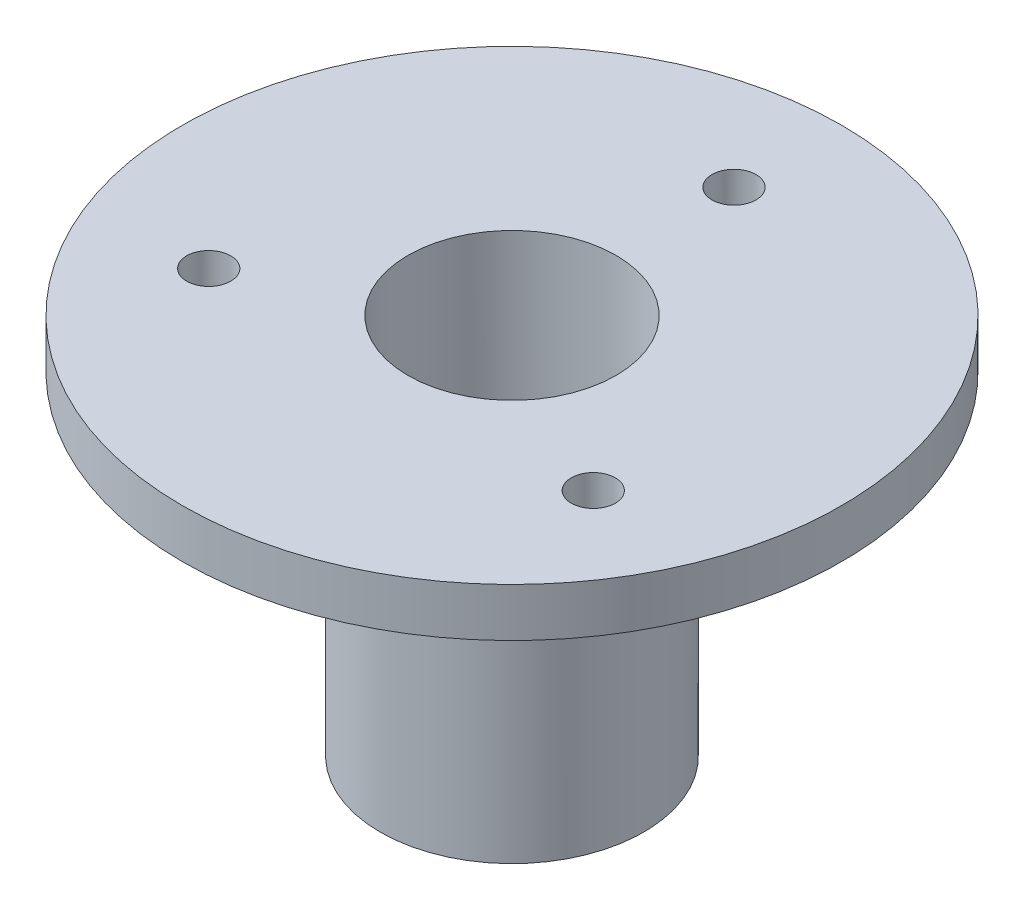
ISO-10303-21;
HEADER;
FILE_DESCRIPTION(('STEP AP214'),'2;1');
FILE_NAME('part.step','',(''),(''),'','','');
FILE_SCHEMA(('AUTOMOTIVE_DESIGN { 1 0 10303 214 1 1 1 1 }'));
ENDSEC;
DATA;
#1=APPLICATION_CONTEXT('core data for automotive mechanical design processes');
#2=APPLICATION_PROTOCOL_DEFINITION('international standard','automotive_design',2000,#1);
#3=PRODUCT_CONTEXT('',#1,'mechanical');
#4=PRODUCT('Part','Part','',(#3));
#5=PRODUCT_RELATED_PRODUCT_CATEGORY('part','',(#4));
#6=PRODUCT_DEFINITION_FORMATION('','',#4);
#7=PRODUCT_DEFINITION_CONTEXT('part definition',#1,'design');
#8=PRODUCT_DEFINITION('design','',#6,#7);
#9=PRODUCT_DEFINITION_SHAPE('','',#8);
#10=(LENGTH_UNIT() NAMED_UNIT(*) SI_UNIT(.MILLI.,.METRE.));
#11=(NAMED_UNIT(*) PLANE_ANGLE_UNIT() SI_UNIT($,.RADIAN.));
#12=(NAMED_UNIT(*) SI_UNIT($,.STERADIAN.) SOLID_ANGLE_UNIT());
#13=UNCERTAINTY_MEASURE_WITH_UNIT(LENGTH_MEASURE(1.E-05),#10,'distance_accuracy_value','');
#14=(GEOMETRIC_REPRESENTATION_CONTEXT(3) GLOBAL_UNCERTAINTY_ASSIGNED_CONTEXT((#13)) GLOBAL_UNIT_ASSIGNED_CONTEXT((#10,
#11,#12)) REPRESENTATION_CONTEXT('',''));
#15=CARTESIAN_POINT('',(0.,0.,0.));
#16=DIRECTION('',(0.,0.,1.));
#17=DIRECTION('',(1.,0.,0.));
#18=AXIS2_PLACEMENT_3D('',#15,#16,#17);
#19=CARTESIAN_POINT('',(0.,0.,0.));
#20=DIRECTION('',(0.,1.,0.));
#21=DIRECTION('',(0.,0.,1.));
#22=AXIS2_PLACEMENT_3D('',#19,#20,#21);
#23=PLANE('',#22);
#24=CARTESIAN_POINT('',(27.712812921102,0.,16.));
#25=DIRECTION('',(0.,1.,0.));
#26=DIRECTION('',(0.,0.,1.));
#27=AXIS2_PLACEMENT_3D('',#24,#25,#26);
#28=CIRCLE('',#27,7.5);
#29=CARTESIAN_POINT('',(27.712812921102,0.,23.5));
#30=VERTEX_POINT('',#29);
#31=EDGE_CURVE('E46',#30,#30,#28,.F.);
#32=ORIENTED_EDGE('',*,*,#31,.F.);
#33=EDGE_LOOP('',(#32));
#34=FACE_BOUND('',#33,.T.);
#35=CARTESIAN_POINT('',(0.,0.,0.));
#36=DIRECTION('',(0.,1.,0.));
#37=DIRECTION('',(0.,0.,1.));
#38=AXIS2_PLACEMENT_3D('',#35,#36,#37);
#39=CIRCLE('',#38,19.);
#40=CARTESIAN_POINT('',(0.,0.,19.));
#41=VERTEX_POINT('',#40);
#42=EDGE_CURVE('E54',#41,#41,#39,.F.);
#43=ORIENTED_EDGE('',*,*,#42,.F.);
#44=EDGE_LOOP('',(#43));
#45=FACE_BOUND('',#44,.T.);
#46=CARTESIAN_POINT('',(0.,0.,0.));
#47=DIRECTION('',(0.,1.,0.));
#48=DIRECTION('',(0.,0.,1.));
#49=AXIS2_PLACEMENT_3D('',#46,#47,#48);
#50=CIRCLE('',#49,47.5);
#51=CARTESIAN_POINT('',(0.,0.,47.5));
#52=VERTEX_POINT('',#51);
#53=EDGE_CURVE('E60',#52,#52,#50,.T.);
#54=ORIENTED_EDGE('',*,*,#53,.F.);
#55=EDGE_LOOP('',(#54));
#56=FACE_BOUND('',#55,.T.);
#57=CARTESIAN_POINT('',(-27.712812921102,0.,16.));
#58=DIRECTION('',(0.,1.,0.));
#59=DIRECTION('',(0.,0.,1.));
#60=AXIS2_PLACEMENT_3D('',#57,#58,#59);
#61=CIRCLE('',#60,7.5);
#62=CARTESIAN_POINT('',(-27.712812921102,0.,23.5));
#63=VERTEX_POINT('',#62);
#64=EDGE_CURVE('E50',#63,#63,#61,.F.);
#65=ORIENTED_EDGE('',*,*,#64,.F.);
#66=EDGE_LOOP('',(#65));
#67=FACE_BOUND('',#66,.T.);
#68=CARTESIAN_POINT('',(0.,0.,-32.));
#69=DIRECTION('',(0.,1.,0.));
#70=DIRECTION('',(0.,0.,1.));
#71=AXIS2_PLACEMENT_3D('',#68,#69,#70);
#72=CIRCLE('',#71,7.5);
#73=CARTESIAN_POINT('',(0.,0.,-24.5));
#74=VERTEX_POINT('',#73);
#75=EDGE_CURVE('E10',#74,#74,#72,.F.);
#76=ORIENTED_EDGE('',*,*,#75,.F.);
#77=EDGE_LOOP('',(#76));
#78=FACE_BOUND('',#77,.T.);
#79=ADVANCED_FACE('F39',(#34,#45,#56,#67,#78),#23,.F.);
#80=CARTESIAN_POINT('',(0.,7.,0.));
#81=DIRECTION('',(0.,1.,0.));
#82=DIRECTION('',(0.,0.,1.));
#83=AXIS2_PLACEMENT_3D('',#80,#81,#82);
#84=PLANE('',#83);
#85=CARTESIAN_POINT('',(27.712812921102,7.,16.));
#86=DIRECTION('',(0.,1.,0.));
#87=DIRECTION('',(0.,0.,1.));
#88=AXIS2_PLACEMENT_3D('',#85,#86,#87);
#89=CIRCLE('',#88,3.17500000000012);
#90=CARTESIAN_POINT('',(27.712812921102,7.,19.1750000000001));
#91=VERTEX_POINT('',#90);
#92=EDGE_CURVE('E71',#91,#91,#89,.T.);
#93=ORIENTED_EDGE('',*,*,#92,.F.);
#94=EDGE_LOOP('',(#93));
#95=FACE_BOUND('',#94,.T.);
#96=CARTESIAN_POINT('',(0.,7.,-32.));
#97=DIRECTION('',(0.,1.,0.));
#98=DIRECTION('',(0.,0.,1.));
#99=AXIS2_PLACEMENT_3D('',#96,#97,#98);
#100=CIRCLE('',#99,3.175);
#101=CARTESIAN_POINT('',(0.,7.,-28.825));
#102=VERTEX_POINT('',#101);
#103=EDGE_CURVE('E63',#102,#102,#100,.T.);
#104=ORIENTED_EDGE('',*,*,#103,.F.);
#105=EDGE_LOOP('',(#104));
#106=FACE_BOUND('',#105,.T.);
#107=CARTESIAN_POINT('',(0.,7.,0.));
#108=DIRECTION('',(0.,1.,0.));
#109=DIRECTION('',(0.,0.,1.));
#110=AXIS2_PLACEMENT_3D('',#107,#108,#109);
#111=CIRCLE('',#110,47.5);
#112=CARTESIAN_POINT('',(0.,7.,47.5));
#113=VERTEX_POINT('',#112);
#114=EDGE_CURVE('E59',#113,#113,#111,.T.);
#115=ORIENTED_EDGE('',*,*,#114,.T.);
#116=EDGE_LOOP('',(#115));
#117=FACE_BOUND('',#116,.T.);
#118=CARTESIAN_POINT('',(0.,7.,0.));
#119=DIRECTION('',(0.,1.,0.));
#120=DIRECTION('',(0.,0.,1.));
#121=AXIS2_PLACEMENT_3D('',#118,#119,#120);
#122=CIRCLE('',#121,15.);
#123=CARTESIAN_POINT('',(0.,7.,15.));
#124=VERTEX_POINT('',#123);
#125=EDGE_CURVE('E68',#124,#124,#122,.T.);
#126=ORIENTED_EDGE('',*,*,#125,.F.);
#127=EDGE_LOOP('',(#126));
#128=FACE_BOUND('',#127,.T.);
#129=CARTESIAN_POINT('',(-27.712812921102,7.,16.));
#130=DIRECTION('',(0.,1.,0.));
#131=DIRECTION('',(0.,0.,1.));
#132=AXIS2_PLACEMENT_3D('',#129,#130,#131);
#133=CIRCLE('',#132,3.17500000000029);
#134=CARTESIAN_POINT('',(-27.712812921102,7.,19.1750000000003));
#135=VERTEX_POINT('',#134);
#136=EDGE_CURVE('E74',#135,#135,#133,.T.);
#137=ORIENTED_EDGE('',*,*,#136,.F.);
#138=EDGE_LOOP('',(#137));
#139=FACE_BOUND('',#138,.T.);
#140=ADVANCED_FACE('F114',(#95,#106,#117,#128,#139),#84,.T.);
#141=CARTESIAN_POINT('',(0.,7.,0.));
#142=DIRECTION('',(0.,-1.,0.));
#143=DIRECTION('',(0.,0.,-1.));
#144=AXIS2_PLACEMENT_3D('',#141,#142,#143);
#145=CYLINDRICAL_SURFACE('',#144,47.5);
#146=ORIENTED_EDGE('',*,*,#114,.F.);
#147=EDGE_LOOP('',(#146));
#148=FACE_BOUND('',#147,.T.);
#149=ORIENTED_EDGE('',*,*,#53,.T.);
#150=EDGE_LOOP('',(#149));
#151=FACE_BOUND('',#150,.T.);
#152=ADVANCED_FACE('F41',(#148,#151),#145,.T.);
#153=CARTESIAN_POINT('',(0.,7.,-32.));
#154=DIRECTION('',(0.,-1.,0.));
#155=DIRECTION('',(0.,0.,-1.));
#156=AXIS2_PLACEMENT_3D('',#153,#154,#155);
#157=CYLINDRICAL_SURFACE('',#156,3.175);
#158=ORIENTED_EDGE('',*,*,#103,.T.);
#159=EDGE_LOOP('',(#158));
#160=FACE_BOUND('',#159,.T.);
#161=CARTESIAN_POINT('',(0.,-3.,-32.));
#162=DIRECTION('',(0.,-1.,0.));
#163=DIRECTION('',(0.,0.,-1.));
#164=AXIS2_PLACEMENT_3D('',#161,#162,#163);
#165=CIRCLE('',#164,3.175);
#166=CARTESIAN_POINT('',(0.,-3.,-35.175));
#167=VERTEX_POINT('',#166);
#168=EDGE_CURVE('E95',#167,#167,#165,.T.);
#169=ORIENTED_EDGE('',*,*,#168,.T.);
#170=EDGE_LOOP('',(#169));
#171=FACE_BOUND('',#170,.T.);
#172=ADVANCED_FACE('F125',(#160,#171),#157,.F.);
#173=CARTESIAN_POINT('',(0.,7.,0.));
#174=DIRECTION('',(0.,-1.,0.));
#175=DIRECTION('',(0.,0.,-1.));
#176=AXIS2_PLACEMENT_3D('',#173,#174,#175);
#177=CYLINDRICAL_SURFACE('',#176,15.);
#178=ORIENTED_EDGE('',*,*,#125,.T.);
#179=EDGE_LOOP('',(#178));
#180=FACE_BOUND('',#179,.T.);
#181=CARTESIAN_POINT('',(0.,-48.,0.));
#182=DIRECTION('',(0.,-1.,0.));
#183=DIRECTION('',(0.,0.,-1.));
#184=AXIS2_PLACEMENT_3D('',#181,#182,#183);
#185=CIRCLE('',#184,15.);
#186=CARTESIAN_POINT('',(0.,-48.,-15.));
#187=VERTEX_POINT('',#186);
#188=EDGE_CURVE('E80',#187,#187,#185,.T.);
#189=ORIENTED_EDGE('',*,*,#188,.T.);
#190=EDGE_LOOP('',(#189));
#191=FACE_BOUND('',#190,.T.);
#192=ADVANCED_FACE('F127',(#180,#191),#177,.F.);
#193=CARTESIAN_POINT('',(27.712812921102,7.,16.));
#194=DIRECTION('',(0.,-1.,0.));
#195=DIRECTION('',(0.,0.,-1.));
#196=AXIS2_PLACEMENT_3D('',#193,#194,#195);
#197=CYLINDRICAL_SURFACE('',#196,3.17500000000012);
#198=ORIENTED_EDGE('',*,*,#92,.T.);
#199=EDGE_LOOP('',(#198));
#200=FACE_BOUND('',#199,.T.);
#201=CARTESIAN_POINT('',(27.712812921102,-3.,16.));
#202=DIRECTION('',(0.,-1.,0.));
#203=DIRECTION('',(0.,0.,-1.));
#204=AXIS2_PLACEMENT_3D('',#201,#202,#203);
#205=CIRCLE('',#204,3.175);
#206=CARTESIAN_POINT('',(27.712812921102,-3.,12.825));
#207=VERTEX_POINT('',#206);
#208=EDGE_CURVE('E89',#207,#207,#205,.T.);
#209=ORIENTED_EDGE('',*,*,#208,.T.);
#210=EDGE_LOOP('',(#209));
#211=FACE_BOUND('',#210,.T.);
#212=ADVANCED_FACE('F131',(#200,#211),#197,.F.);
#213=CARTESIAN_POINT('',(-27.712812921102,7.,16.));
#214=DIRECTION('',(0.,-1.,0.));
#215=DIRECTION('',(0.,0.,-1.));
#216=AXIS2_PLACEMENT_3D('',#213,#214,#215);
#217=CYLINDRICAL_SURFACE('',#216,3.17500000000029);
#218=ORIENTED_EDGE('',*,*,#136,.T.);
#219=EDGE_LOOP('',(#218));
#220=FACE_BOUND('',#219,.T.);
#221=CARTESIAN_POINT('',(-27.712812921102,-3.,16.));
#222=DIRECTION('',(0.,-1.,0.));
#223=DIRECTION('',(0.,0.,-1.));
#224=AXIS2_PLACEMENT_3D('',#221,#222,#223);
#225=CIRCLE('',#224,3.175);
#226=CARTESIAN_POINT('',(-27.712812921102,-3.,12.825));
#227=VERTEX_POINT('',#226);
#228=EDGE_CURVE('E86',#227,#227,#225,.T.);
#229=ORIENTED_EDGE('',*,*,#228,.T.);
#230=EDGE_LOOP('',(#229));
#231=FACE_BOUND('',#230,.T.);
#232=ADVANCED_FACE('F135',(#220,#231),#217,.F.);
#233=CARTESIAN_POINT('',(0.,-48.,0.));
#234=DIRECTION('',(0.,-1.,0.));
#235=DIRECTION('',(0.,0.,-1.));
#236=AXIS2_PLACEMENT_3D('',#233,#234,#235);
#237=PLANE('',#236);
#238=CARTESIAN_POINT('',(0.,-48.,0.));
#239=DIRECTION('',(0.,-1.,0.));
#240=DIRECTION('',(0.,0.,-1.));
#241=AXIS2_PLACEMENT_3D('',#238,#239,#240);
#242=CIRCLE('',#241,19.);
#243=CARTESIAN_POINT('',(0.,-48.,-19.));
#244=VERTEX_POINT('',#243);
#245=EDGE_CURVE('E77',#244,#244,#242,.T.);
#246=ORIENTED_EDGE('',*,*,#245,.T.);
#247=EDGE_LOOP('',(#246));
#248=FACE_BOUND('',#247,.T.);
#249=ORIENTED_EDGE('',*,*,#188,.F.);
#250=EDGE_LOOP('',(#249));
#251=FACE_BOUND('',#250,.T.);
#252=ADVANCED_FACE('F139',(#248,#251),#237,.T.);
#253=CARTESIAN_POINT('',(0.,-48.,0.));
#254=DIRECTION('',(0.,1.,0.));
#255=DIRECTION('',(0.,0.,1.));
#256=AXIS2_PLACEMENT_3D('',#253,#254,#255);
#257=CYLINDRICAL_SURFACE('',#256,19.);
#258=ORIENTED_EDGE('',*,*,#245,.F.);
#259=EDGE_LOOP('',(#258));
#260=FACE_BOUND('',#259,.T.);
#261=ORIENTED_EDGE('',*,*,#42,.T.);
#262=EDGE_LOOP('',(#261));
#263=FACE_BOUND('',#262,.T.);
#264=ADVANCED_FACE('F141',(#260,#263),#257,.T.);
#265=CARTESIAN_POINT('',(-27.712812921102,-3.,16.));
#266=DIRECTION('',(0.,-1.,0.));
#267=DIRECTION('',(0.,0.,-1.));
#268=AXIS2_PLACEMENT_3D('',#265,#266,#267);
#269=PLANE('',#268);
#270=CARTESIAN_POINT('',(-27.712812921102,-3.,16.));
#271=DIRECTION('',(0.,-1.,0.));
#272=DIRECTION('',(0.,0.,-1.));
#273=AXIS2_PLACEMENT_3D('',#270,#271,#272);
#274=CIRCLE('',#273,7.5);
#275=CARTESIAN_POINT('',(-27.712812921102,-3.,8.50000000000002));
#276=VERTEX_POINT('',#275);
#277=EDGE_CURVE('E83',#276,#276,#274,.T.);
#278=ORIENTED_EDGE('',*,*,#277,.T.);
#279=EDGE_LOOP('',(#278));
#280=FACE_BOUND('',#279,.T.);
#281=ORIENTED_EDGE('',*,*,#228,.F.);
#282=EDGE_LOOP('',(#281));
#283=FACE_BOUND('',#282,.T.);
#284=ADVANCED_FACE('F143',(#280,#283),#269,.T.);
#285=CARTESIAN_POINT('',(-27.712812921102,-3.,16.));
#286=DIRECTION('',(0.,1.,0.));
#287=DIRECTION('',(0.,0.,1.));
#288=AXIS2_PLACEMENT_3D('',#285,#286,#287);
#289=CYLINDRICAL_SURFACE('',#288,7.5);
#290=ORIENTED_EDGE('',*,*,#277,.F.);
#291=EDGE_LOOP('',(#290));
#292=FACE_BOUND('',#291,.T.);
#293=ORIENTED_EDGE('',*,*,#64,.T.);
#294=EDGE_LOOP('',(#293));
#295=FACE_BOUND('',#294,.T.);
#296=ADVANCED_FACE('F148',(#292,#295),#289,.T.);
#297=CARTESIAN_POINT('',(27.712812921102,-3.,16.));
#298=DIRECTION('',(0.,-1.,0.));
#299=DIRECTION('',(0.,0.,-1.));
#300=AXIS2_PLACEMENT_3D('',#297,#298,#299);
#301=PLANE('',#300);
#302=CARTESIAN_POINT('',(27.712812921102,-3.,16.));
#303=DIRECTION('',(0.,-1.,0.));
#304=DIRECTION('',(0.,0.,-1.));
#305=AXIS2_PLACEMENT_3D('',#302,#303,#304);
#306=CIRCLE('',#305,7.5);
#307=CARTESIAN_POINT('',(27.712812921102,-3.,8.50000000000002));
#308=VERTEX_POINT('',#307);
#309=EDGE_CURVE('E92',#308,#308,#306,.T.);
#310=ORIENTED_EDGE('',*,*,#309,.T.);
#311=EDGE_LOOP('',(#310));
#312=FACE_BOUND('',#311,.T.);
#313=ORIENTED_EDGE('',*,*,#208,.F.);
#314=EDGE_LOOP('',(#313));
#315=FACE_BOUND('',#314,.T.);
#316=ADVANCED_FACE('F151',(#312,#315),#301,.T.);
#317=CARTESIAN_POINT('',(27.712812921102,-3.,16.));
#318=DIRECTION('',(0.,1.,0.));
#319=DIRECTION('',(0.,0.,1.));
#320=AXIS2_PLACEMENT_3D('',#317,#318,#319);
#321=CYLINDRICAL_SURFACE('',#320,7.5);
#322=ORIENTED_EDGE('',*,*,#309,.F.);
#323=EDGE_LOOP('',(#322));
#324=FACE_BOUND('',#323,.T.);
#325=ORIENTED_EDGE('',*,*,#31,.T.);
#326=EDGE_LOOP('',(#325));
#327=FACE_BOUND('',#326,.T.);
#328=ADVANCED_FACE('F111',(#324,#327),#321,.T.);
#329=CARTESIAN_POINT('',(0.,-3.,-32.));
#330=DIRECTION('',(0.,-1.,0.));
#331=DIRECTION('',(0.,0.,-1.));
#332=AXIS2_PLACEMENT_3D('',#329,#330,#331);
#333=PLANE('',#332);
#334=CARTESIAN_POINT('',(0.,-3.,-32.));
#335=DIRECTION('',(0.,-1.,0.));
#336=DIRECTION('',(0.,0.,-1.));
#337=AXIS2_PLACEMENT_3D('',#334,#335,#336);
#338=CIRCLE('',#337,7.5);
#339=CARTESIAN_POINT('',(0.,-3.,-39.5));
#340=VERTEX_POINT('',#339);
#341=EDGE_CURVE('E98',#340,#340,#338,.T.);
#342=ORIENTED_EDGE('',*,*,#341,.T.);
#343=EDGE_LOOP('',(#342));
#344=FACE_BOUND('',#343,.T.);
#345=ORIENTED_EDGE('',*,*,#168,.F.);
#346=EDGE_LOOP('',(#345));
#347=FACE_BOUND('',#346,.T.);
#348=ADVANCED_FACE('F102',(#344,#347),#333,.T.);
#349=CARTESIAN_POINT('',(0.,-3.,-32.));
#350=DIRECTION('',(0.,1.,0.));
#351=DIRECTION('',(0.,0.,1.));
#352=AXIS2_PLACEMENT_3D('',#349,#350,#351);
#353=CYLINDRICAL_SURFACE('',#352,7.5);
#354=ORIENTED_EDGE('',*,*,#341,.F.);
#355=EDGE_LOOP('',(#354));
#356=FACE_BOUND('',#355,.T.);
#357=ORIENTED_EDGE('',*,*,#75,.T.);
#358=EDGE_LOOP('',(#357));
#359=FACE_BOUND('',#358,.T.);
#360=ADVANCED_FACE('F105',(#356,#359),#353,.T.);
#361=CLOSED_SHELL('',(#79,#140,#152,#172,#192,#212,#232,#252,#264,#284,#296,#316,#328,#348,#360));
#362=MANIFOLD_SOLID_BREP('B2',#361);
#363=ADVANCED_BREP_SHAPE_REPRESENTATION('',(#18,#362),#14);
#364=SHAPE_DEFINITION_REPRESENTATION(#9,#363);
ENDSEC;
END-ISO-10303-21;
